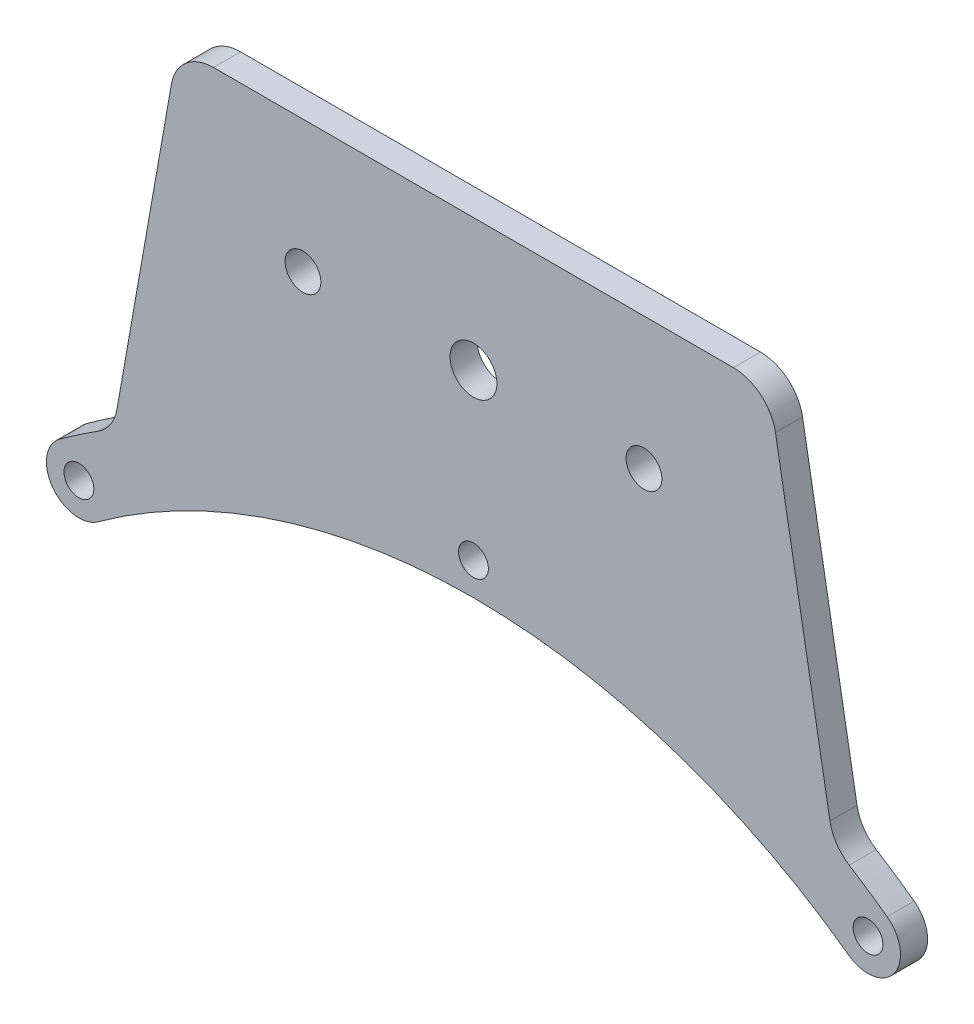
ISO-10303-21;
HEADER;
FILE_DESCRIPTION(('STEP AP214'),'2;1');
FILE_NAME('part.step','',(''),(''),'','','');
FILE_SCHEMA(('AUTOMOTIVE_DESIGN { 1 0 10303 214 1 1 1 1 }'));
ENDSEC;
DATA;
#1=APPLICATION_CONTEXT('core data for automotive mechanical design processes');
#2=APPLICATION_PROTOCOL_DEFINITION('international standard','automotive_design',2000,#1);
#3=PRODUCT_CONTEXT('',#1,'mechanical');
#4=PRODUCT('Part','Part','',(#3));
#5=PRODUCT_RELATED_PRODUCT_CATEGORY('part','',(#4));
#6=PRODUCT_DEFINITION_FORMATION('','',#4);
#7=PRODUCT_DEFINITION_CONTEXT('part definition',#1,'design');
#8=PRODUCT_DEFINITION('design','',#6,#7);
#9=PRODUCT_DEFINITION_SHAPE('','',#8);
#10=(LENGTH_UNIT() NAMED_UNIT(*) SI_UNIT(.MILLI.,.METRE.));
#11=(NAMED_UNIT(*) PLANE_ANGLE_UNIT() SI_UNIT($,.RADIAN.));
#12=(NAMED_UNIT(*) SI_UNIT($,.STERADIAN.) SOLID_ANGLE_UNIT());
#13=UNCERTAINTY_MEASURE_WITH_UNIT(LENGTH_MEASURE(1.E-05),#10,'distance_accuracy_value','');
#14=(GEOMETRIC_REPRESENTATION_CONTEXT(3) GLOBAL_UNCERTAINTY_ASSIGNED_CONTEXT((#13)) GLOBAL_UNIT_ASSIGNED_CONTEXT((#10,
#11,#12)) REPRESENTATION_CONTEXT('',''));
#15=CARTESIAN_POINT('',(0.,0.,0.));
#16=DIRECTION('',(0.,0.,1.));
#17=DIRECTION('',(1.,0.,0.));
#18=AXIS2_PLACEMENT_3D('',#15,#16,#17);
#19=CARTESIAN_POINT('',(46.2822107655095,-15.0380018629167,1.5875));
#20=DIRECTION('',(0.,0.,-1.));
#21=DIRECTION('',(-1.,0.,0.));
#22=AXIS2_PLACEMENT_3D('',#19,#20,#21);
#23=PLANE('',#22);
#24=CARTESIAN_POINT('',(46.2822107655095,-15.0380018629167,1.5875));
#25=DIRECTION('',(0.,0.,1.));
#26=DIRECTION('',(-1.,0.,0.));
#27=AXIS2_PLACEMENT_3D('',#24,#25,#26);
#28=CIRCLE('',#27,3.80999999999999);
#29=CARTESIAN_POINT('',(44.0427489542751,-18.1203566114853,1.5875));
#30=VERTEX_POINT('',#29);
#31=CARTESIAN_POINT('',(48.5216725767438,-11.9556471143482,1.5875));
#32=VERTEX_POINT('',#31);
#33=EDGE_CURVE('E255',#30,#32,#28,.T.);
#34=ORIENTED_EDGE('',*,*,#33,.T.);
#35=CARTESIAN_POINT('',(0.,-78.74,1.5875));
#36=DIRECTION('',(0.,0.,1.));
#37=DIRECTION('',(1.,0.,0.));
#38=AXIS2_PLACEMENT_3D('',#35,#36,#37);
#39=CIRCLE('',#38,82.55);
#40=CARTESIAN_POINT('',(44.0718905745348,-8.93906188892425,1.5875));
#41=VERTEX_POINT('',#40);
#42=EDGE_CURVE('E135',#32,#41,#39,.T.);
#43=ORIENTED_EDGE('',*,*,#42,.T.);
#44=CARTESIAN_POINT('',(46.7412964239918,-4.71126430497053,1.5875));
#45=DIRECTION('',(0.,0.,-1.));
#46=DIRECTION('',(-1.,0.,0.));
#47=AXIS2_PLACEMENT_3D('',#44,#45,#46);
#48=CIRCLE('',#47,5.);
#49=CARTESIAN_POINT('',(41.8172576589308,-5.57950519330519,1.5875));
#50=VERTEX_POINT('',#49);
#51=EDGE_CURVE('E254',#41,#50,#48,.T.);
#52=ORIENTED_EDGE('',*,*,#51,.T.);
#53=DIRECTION('',(-0.173648177666931,0.984807753012208,0.));
#54=VECTOR('',#53,1.);
#55=CARTESIAN_POINT('',(35.424038765061,30.6782408883346,1.5875));
#56=LINE('',#55,#54);
#57=CARTESIAN_POINT('',(35.424038765061,30.6782408883346,1.5875));
#58=VERTEX_POINT('',#57);
#59=EDGE_CURVE('E261',#50,#58,#56,.T.);
#60=ORIENTED_EDGE('',*,*,#59,.T.);
#61=CARTESIAN_POINT('',(30.5,29.81,1.5875));
#62=DIRECTION('',(0.,0.,1.));
#63=DIRECTION('',(-1.,0.,0.));
#64=AXIS2_PLACEMENT_3D('',#61,#62,#63);
#65=CIRCLE('',#64,5.);
#66=CARTESIAN_POINT('',(30.5,34.81,1.5875));
#67=VERTEX_POINT('',#66);
#68=EDGE_CURVE('E296',#58,#67,#65,.T.);
#69=ORIENTED_EDGE('',*,*,#68,.T.);
#70=DIRECTION('',(-1.,0.,0.));
#71=VECTOR('',#70,1.);
#72=CARTESIAN_POINT('',(-30.5,34.81,1.5875));
#73=LINE('',#72,#71);
#74=CARTESIAN_POINT('',(-30.5,34.81,1.5875));
#75=VERTEX_POINT('',#74);
#76=EDGE_CURVE('E300',#67,#75,#73,.T.);
#77=ORIENTED_EDGE('',*,*,#76,.T.);
#78=CARTESIAN_POINT('',(-30.5,29.81,1.5875));
#79=DIRECTION('',(0.,0.,1.));
#80=DIRECTION('',(1.,0.,0.));
#81=AXIS2_PLACEMENT_3D('',#78,#79,#80);
#82=CIRCLE('',#81,5.);
#83=CARTESIAN_POINT('',(-35.424038765061,30.6782408883346,1.5875));
#84=VERTEX_POINT('',#83);
#85=EDGE_CURVE('E303',#75,#84,#82,.T.);
#86=ORIENTED_EDGE('',*,*,#85,.T.);
#87=DIRECTION('',(-0.17364817766693,-0.984807753012208,0.));
#88=VECTOR('',#87,1.);
#89=CARTESIAN_POINT('',(-35.424038765061,30.6782408883346,1.5875));
#90=LINE('',#89,#88);
#91=CARTESIAN_POINT('',(-41.8172576589307,-5.57950519330519,1.5875));
#92=VERTEX_POINT('',#91);
#93=EDGE_CURVE('E523',#84,#92,#90,.T.);
#94=ORIENTED_EDGE('',*,*,#93,.T.);
#95=CARTESIAN_POINT('',(-46.7412964239918,-4.71126430497054,1.5875));
#96=DIRECTION('',(0.,0.,-1.));
#97=DIRECTION('',(-1.,0.,0.));
#98=AXIS2_PLACEMENT_3D('',#95,#96,#97);
#99=CIRCLE('',#98,5.);
#100=CARTESIAN_POINT('',(-44.0718905745348,-8.93906188892424,1.5875));
#101=VERTEX_POINT('',#100);
#102=EDGE_CURVE('E174',#92,#101,#99,.T.);
#103=ORIENTED_EDGE('',*,*,#102,.T.);
#104=CARTESIAN_POINT('',(0.,-78.74,1.5875));
#105=DIRECTION('',(0.,0.,1.));
#106=DIRECTION('',(1.,0.,0.));
#107=AXIS2_PLACEMENT_3D('',#104,#105,#106);
#108=CIRCLE('',#107,82.55);
#109=CARTESIAN_POINT('',(-48.5216725767438,-11.9556471143482,1.5875));
#110=VERTEX_POINT('',#109);
#111=EDGE_CURVE('E168',#101,#110,#108,.T.);
#112=ORIENTED_EDGE('',*,*,#111,.T.);
#113=CARTESIAN_POINT('',(-46.2822107655095,-15.0380018629167,1.5875));
#114=DIRECTION('',(0.,0.,1.));
#115=DIRECTION('',(1.,0.,0.));
#116=AXIS2_PLACEMENT_3D('',#113,#114,#115);
#117=CIRCLE('',#116,3.80999999999999);
#118=CARTESIAN_POINT('',(-44.0427489542751,-18.1203566114853,1.5875));
#119=VERTEX_POINT('',#118);
#120=EDGE_CURVE('E172',#110,#119,#117,.T.);
#121=ORIENTED_EDGE('',*,*,#120,.T.);
#122=CARTESIAN_POINT('',(0.,-78.74,1.5875));
#123=DIRECTION('',(0.,0.,-1.));
#124=DIRECTION('',(-1.,0.,0.));
#125=AXIS2_PLACEMENT_3D('',#122,#123,#124);
#126=CIRCLE('',#125,74.93);
#127=EDGE_CURVE('E67',#119,#30,#126,.T.);
#128=ORIENTED_EDGE('',*,*,#127,.T.);
#129=EDGE_LOOP('',(#34,#43,#52,#60,#69,#77,#86,#94,#103,#112,#121,#128));
#130=FACE_BOUND('',#129,.T.);
#131=CARTESIAN_POINT('',(0.,0.,1.5875));
#132=DIRECTION('',(0.,0.,1.));
#133=DIRECTION('',(1.,0.,0.));
#134=AXIS2_PLACEMENT_3D('',#131,#132,#133);
#135=CIRCLE('',#134,1.75);
#136=CARTESIAN_POINT('',(1.75,0.,1.5875));
#137=VERTEX_POINT('',#136);
#138=EDGE_CURVE('E241',#137,#137,#135,.T.);
#139=ORIENTED_EDGE('',*,*,#138,.F.);
#140=EDGE_LOOP('',(#139));
#141=FACE_BOUND('',#140,.T.);
#142=CARTESIAN_POINT('',(-46.2822107655095,-15.0380018629167,1.5875));
#143=DIRECTION('',(0.,0.,1.));
#144=DIRECTION('',(1.,0.,0.));
#145=AXIS2_PLACEMENT_3D('',#142,#143,#144);
#146=CIRCLE('',#145,1.75);
#147=CARTESIAN_POINT('',(-44.5322107655095,-15.0380018629167,1.5875));
#148=VERTEX_POINT('',#147);
#149=EDGE_CURVE('E393',#148,#148,#146,.T.);
#150=ORIENTED_EDGE('',*,*,#149,.F.);
#151=EDGE_LOOP('',(#150));
#152=FACE_BOUND('',#151,.T.);
#153=CARTESIAN_POINT('',(46.2822107655095,-15.0380018629167,1.5875));
#154=DIRECTION('',(0.,0.,1.));
#155=DIRECTION('',(1.,0.,0.));
#156=AXIS2_PLACEMENT_3D('',#153,#154,#155);
#157=CIRCLE('',#156,1.75000000000001);
#158=CARTESIAN_POINT('',(48.0322107655095,-15.0380018629167,1.5875));
#159=VERTEX_POINT('',#158);
#160=EDGE_CURVE('E403',#159,#159,#157,.T.);
#161=ORIENTED_EDGE('',*,*,#160,.F.);
#162=EDGE_LOOP('',(#161));
#163=FACE_BOUND('',#162,.T.);
#164=CARTESIAN_POINT('',(-20.,19.31,1.5875));
#165=DIRECTION('',(0.,0.,1.));
#166=DIRECTION('',(1.,0.,0.));
#167=AXIS2_PLACEMENT_3D('',#164,#165,#166);
#168=CIRCLE('',#167,2.1);
#169=CARTESIAN_POINT('',(-17.9,19.31,1.5875));
#170=VERTEX_POINT('',#169);
#171=EDGE_CURVE('E218',#170,#170,#168,.T.);
#172=ORIENTED_EDGE('',*,*,#171,.F.);
#173=EDGE_LOOP('',(#172));
#174=FACE_BOUND('',#173,.T.);
#175=CARTESIAN_POINT('',(20.,19.31,1.5875));
#176=DIRECTION('',(0.,0.,1.));
#177=DIRECTION('',(1.,0.,0.));
#178=AXIS2_PLACEMENT_3D('',#175,#176,#177);
#179=CIRCLE('',#178,2.1);
#180=CARTESIAN_POINT('',(22.1,19.31,1.5875));
#181=VERTEX_POINT('',#180);
#182=EDGE_CURVE('E214',#181,#181,#179,.T.);
#183=ORIENTED_EDGE('',*,*,#182,.F.);
#184=EDGE_LOOP('',(#183));
#185=FACE_BOUND('',#184,.T.);
#186=CARTESIAN_POINT('',(0.,19.31,1.5875));
#187=DIRECTION('',(0.,0.,1.));
#188=DIRECTION('',(1.,0.,0.));
#189=AXIS2_PLACEMENT_3D('',#186,#187,#188);
#190=CIRCLE('',#189,2.75);
#191=CARTESIAN_POINT('',(2.75,19.31,1.5875));
#192=VERTEX_POINT('',#191);
#193=EDGE_CURVE('E215',#192,#192,#190,.T.);
#194=ORIENTED_EDGE('',*,*,#193,.F.);
#195=EDGE_LOOP('',(#194));
#196=FACE_BOUND('',#195,.T.);
#197=ADVANCED_FACE('F44',(#130,#141,#152,#163,#174,#185,#196),#23,.F.);
#198=CARTESIAN_POINT('',(46.2822107655095,-15.0380018629167,-1.5875));
#199=DIRECTION('',(0.,0.,-1.));
#200=DIRECTION('',(-1.,0.,0.));
#201=AXIS2_PLACEMENT_3D('',#198,#199,#200);
#202=PLANE('',#201);
#203=CARTESIAN_POINT('',(20.,19.31,-1.5875));
#204=DIRECTION('',(0.,0.,1.));
#205=DIRECTION('',(1.,0.,0.));
#206=AXIS2_PLACEMENT_3D('',#203,#204,#205);
#207=CIRCLE('',#206,2.1);
#208=CARTESIAN_POINT('',(22.1,19.31,-1.5875));
#209=VERTEX_POINT('',#208);
#210=EDGE_CURVE('E208',#209,#209,#207,.T.);
#211=ORIENTED_EDGE('',*,*,#210,.T.);
#212=EDGE_LOOP('',(#211));
#213=FACE_BOUND('',#212,.T.);
#214=CARTESIAN_POINT('',(46.2822107655095,-15.0380018629167,-1.5875));
#215=DIRECTION('',(0.,0.,1.));
#216=DIRECTION('',(1.,0.,0.));
#217=AXIS2_PLACEMENT_3D('',#214,#215,#216);
#218=CIRCLE('',#217,1.75000000000001);
#219=CARTESIAN_POINT('',(48.0322107655095,-15.0380018629167,-1.5875));
#220=VERTEX_POINT('',#219);
#221=EDGE_CURVE('E223',#220,#220,#218,.T.);
#222=ORIENTED_EDGE('',*,*,#221,.T.);
#223=EDGE_LOOP('',(#222));
#224=FACE_BOUND('',#223,.T.);
#225=CARTESIAN_POINT('',(0.,0.,-1.5875));
#226=DIRECTION('',(0.,0.,1.));
#227=DIRECTION('',(1.,0.,0.));
#228=AXIS2_PLACEMENT_3D('',#225,#226,#227);
#229=CIRCLE('',#228,1.75);
#230=CARTESIAN_POINT('',(1.75,0.,-1.5875));
#231=VERTEX_POINT('',#230);
#232=EDGE_CURVE('E388',#231,#231,#229,.T.);
#233=ORIENTED_EDGE('',*,*,#232,.T.);
#234=EDGE_LOOP('',(#233));
#235=FACE_BOUND('',#234,.T.);
#236=CARTESIAN_POINT('',(46.2822107655095,-15.0380018629167,-1.5875));
#237=DIRECTION('',(0.,0.,1.));
#238=DIRECTION('',(-1.,0.,0.));
#239=AXIS2_PLACEMENT_3D('',#236,#237,#238);
#240=CIRCLE('',#239,3.80999999999999);
#241=CARTESIAN_POINT('',(44.0427489542751,-18.1203566114853,-1.5875));
#242=VERTEX_POINT('',#241);
#243=CARTESIAN_POINT('',(48.5216725767438,-11.9556471143482,-1.5875));
#244=VERTEX_POINT('',#243);
#245=EDGE_CURVE('E235',#242,#244,#240,.T.);
#246=ORIENTED_EDGE('',*,*,#245,.F.);
#247=CARTESIAN_POINT('',(0.,-78.74,-1.5875));
#248=DIRECTION('',(0.,0.,-1.));
#249=DIRECTION('',(-1.,0.,0.));
#250=AXIS2_PLACEMENT_3D('',#247,#248,#249);
#251=CIRCLE('',#250,74.93);
#252=CARTESIAN_POINT('',(-44.0427489542751,-18.1203566114853,-1.5875));
#253=VERTEX_POINT('',#252);
#254=EDGE_CURVE('E127',#253,#242,#251,.T.);
#255=ORIENTED_EDGE('',*,*,#254,.F.);
#256=CARTESIAN_POINT('',(-46.2822107655095,-15.0380018629167,-1.5875));
#257=DIRECTION('',(0.,0.,1.));
#258=DIRECTION('',(1.,0.,0.));
#259=AXIS2_PLACEMENT_3D('',#256,#257,#258);
#260=CIRCLE('',#259,3.80999999999999);
#261=CARTESIAN_POINT('',(-48.5216725767438,-11.9556471143482,-1.5875));
#262=VERTEX_POINT('',#261);
#263=EDGE_CURVE('E119',#262,#253,#260,.T.);
#264=ORIENTED_EDGE('',*,*,#263,.F.);
#265=CARTESIAN_POINT('',(0.,-78.74,-1.5875));
#266=DIRECTION('',(0.,0.,1.));
#267=DIRECTION('',(1.,0.,0.));
#268=AXIS2_PLACEMENT_3D('',#265,#266,#267);
#269=CIRCLE('',#268,82.55);
#270=CARTESIAN_POINT('',(-44.0718905745348,-8.93906188892424,-1.5875));
#271=VERTEX_POINT('',#270);
#272=EDGE_CURVE('E183',#271,#262,#269,.T.);
#273=ORIENTED_EDGE('',*,*,#272,.F.);
#274=CARTESIAN_POINT('',(-46.7412964239918,-4.71126430497054,-1.5875));
#275=DIRECTION('',(0.,0.,-1.));
#276=DIRECTION('',(-1.,0.,0.));
#277=AXIS2_PLACEMENT_3D('',#274,#275,#276);
#278=CIRCLE('',#277,5.);
#279=CARTESIAN_POINT('',(-41.8172576589307,-5.57950519330519,-1.5875));
#280=VERTEX_POINT('',#279);
#281=EDGE_CURVE('E313',#280,#271,#278,.T.);
#282=ORIENTED_EDGE('',*,*,#281,.F.);
#283=DIRECTION('',(-0.17364817766693,-0.984807753012208,0.));
#284=VECTOR('',#283,1.);
#285=CARTESIAN_POINT('',(-35.424038765061,30.6782408883346,-1.5875));
#286=LINE('',#285,#284);
#287=CARTESIAN_POINT('',(-35.424038765061,30.6782408883346,-1.5875));
#288=VERTEX_POINT('',#287);
#289=EDGE_CURVE('E318',#288,#280,#286,.T.);
#290=ORIENTED_EDGE('',*,*,#289,.F.);
#291=CARTESIAN_POINT('',(-30.5,29.81,-1.5875));
#292=DIRECTION('',(0.,0.,1.));
#293=DIRECTION('',(1.,0.,0.));
#294=AXIS2_PLACEMENT_3D('',#291,#292,#293);
#295=CIRCLE('',#294,5.);
#296=CARTESIAN_POINT('',(-30.5,34.81,-1.5875));
#297=VERTEX_POINT('',#296);
#298=EDGE_CURVE('E343',#297,#288,#295,.T.);
#299=ORIENTED_EDGE('',*,*,#298,.F.);
#300=DIRECTION('',(-1.,0.,0.));
#301=VECTOR('',#300,1.);
#302=CARTESIAN_POINT('',(-30.5,34.81,-1.5875));
#303=LINE('',#302,#301);
#304=CARTESIAN_POINT('',(30.5,34.81,-1.5875));
#305=VERTEX_POINT('',#304);
#306=EDGE_CURVE('E340',#305,#297,#303,.T.);
#307=ORIENTED_EDGE('',*,*,#306,.F.);
#308=CARTESIAN_POINT('',(30.5,29.81,-1.5875));
#309=DIRECTION('',(0.,0.,1.));
#310=DIRECTION('',(-1.,0.,0.));
#311=AXIS2_PLACEMENT_3D('',#308,#309,#310);
#312=CIRCLE('',#311,5.);
#313=CARTESIAN_POINT('',(35.424038765061,30.6782408883346,-1.5875));
#314=VERTEX_POINT('',#313);
#315=EDGE_CURVE('E344',#314,#305,#312,.T.);
#316=ORIENTED_EDGE('',*,*,#315,.F.);
#317=DIRECTION('',(-0.173648177666931,0.984807753012208,0.));
#318=VECTOR('',#317,1.);
#319=CARTESIAN_POINT('',(35.424038765061,30.6782408883346,-1.5875));
#320=LINE('',#319,#318);
#321=CARTESIAN_POINT('',(41.8172576589308,-5.57950519330519,-1.5875));
#322=VERTEX_POINT('',#321);
#323=EDGE_CURVE('E507',#322,#314,#320,.T.);
#324=ORIENTED_EDGE('',*,*,#323,.F.);
#325=CARTESIAN_POINT('',(46.7412964239918,-4.71126430497053,-1.5875));
#326=DIRECTION('',(0.,0.,-1.));
#327=DIRECTION('',(-1.,0.,0.));
#328=AXIS2_PLACEMENT_3D('',#325,#326,#327);
#329=CIRCLE('',#328,5.);
#330=CARTESIAN_POINT('',(44.0718905745348,-8.93906188892425,-1.5875));
#331=VERTEX_POINT('',#330);
#332=EDGE_CURVE('E245',#331,#322,#329,.T.);
#333=ORIENTED_EDGE('',*,*,#332,.F.);
#334=CARTESIAN_POINT('',(0.,-78.74,-1.5875));
#335=DIRECTION('',(0.,0.,1.));
#336=DIRECTION('',(1.,0.,0.));
#337=AXIS2_PLACEMENT_3D('',#334,#335,#336);
#338=CIRCLE('',#337,82.55);
#339=EDGE_CURVE('E240',#244,#331,#338,.T.);
#340=ORIENTED_EDGE('',*,*,#339,.F.);
#341=EDGE_LOOP('',(#246,#255,#264,#273,#282,#290,#299,#307,#316,#324,#333,#340));
#342=FACE_BOUND('',#341,.T.);
#343=CARTESIAN_POINT('',(-46.2822107655095,-15.0380018629167,-1.5875));
#344=DIRECTION('',(0.,0.,1.));
#345=DIRECTION('',(1.,0.,0.));
#346=AXIS2_PLACEMENT_3D('',#343,#344,#345);
#347=CIRCLE('',#346,1.75);
#348=CARTESIAN_POINT('',(-44.5322107655095,-15.0380018629167,-1.5875));
#349=VERTEX_POINT('',#348);
#350=EDGE_CURVE('E389',#349,#349,#347,.T.);
#351=ORIENTED_EDGE('',*,*,#350,.T.);
#352=EDGE_LOOP('',(#351));
#353=FACE_BOUND('',#352,.T.);
#354=CARTESIAN_POINT('',(-20.,19.31,-1.5875));
#355=DIRECTION('',(0.,0.,1.));
#356=DIRECTION('',(1.,0.,0.));
#357=AXIS2_PLACEMENT_3D('',#354,#355,#356);
#358=CIRCLE('',#357,2.1);
#359=CARTESIAN_POINT('',(-17.9,19.31,-1.5875));
#360=VERTEX_POINT('',#359);
#361=EDGE_CURVE('E224',#360,#360,#358,.T.);
#362=ORIENTED_EDGE('',*,*,#361,.T.);
#363=EDGE_LOOP('',(#362));
#364=FACE_BOUND('',#363,.T.);
#365=CARTESIAN_POINT('',(0.,19.31,-1.5875));
#366=DIRECTION('',(0.,0.,1.));
#367=DIRECTION('',(1.,0.,0.));
#368=AXIS2_PLACEMENT_3D('',#365,#366,#367);
#369=CIRCLE('',#368,2.75);
#370=CARTESIAN_POINT('',(2.75,19.31,-1.5875));
#371=VERTEX_POINT('',#370);
#372=EDGE_CURVE('E418',#371,#371,#369,.T.);
#373=ORIENTED_EDGE('',*,*,#372,.T.);
#374=EDGE_LOOP('',(#373));
#375=FACE_BOUND('',#374,.T.);
#376=ADVANCED_FACE('F369',(#213,#224,#235,#342,#353,#364,#375),#202,.T.);
#377=CARTESIAN_POINT('',(46.2822107655095,-15.0380018629167,1.5875));
#378=DIRECTION('',(0.,0.,-1.));
#379=DIRECTION('',(-1.,0.,0.));
#380=AXIS2_PLACEMENT_3D('',#377,#378,#379);
#381=CYLINDRICAL_SURFACE('',#380,3.80999999999999);
#382=ORIENTED_EDGE('',*,*,#245,.T.);
#383=DIRECTION('',(0.,0.,-1.));
#384=VECTOR('',#383,1.);
#385=CARTESIAN_POINT('',(48.5216725767438,-11.9556471143482,1.5875));
#386=LINE('',#385,#384);
#387=EDGE_CURVE('E12',#32,#244,#386,.T.);
#388=ORIENTED_EDGE('',*,*,#387,.F.);
#389=ORIENTED_EDGE('',*,*,#33,.F.);
#390=DIRECTION('',(0.,0.,-1.));
#391=VECTOR('',#390,1.);
#392=CARTESIAN_POINT('',(44.0427489542751,-18.1203566114853,1.5875));
#393=LINE('',#392,#391);
#394=EDGE_CURVE('E192',#30,#242,#393,.T.);
#395=ORIENTED_EDGE('',*,*,#394,.T.);
#396=EDGE_LOOP('',(#382,#388,#389,#395));
#397=FACE_BOUND('',#396,.T.);
#398=ADVANCED_FACE('F47',(#397),#381,.T.);
#399=CARTESIAN_POINT('',(0.,-78.74,1.5875));
#400=DIRECTION('',(0.,0.,-1.));
#401=DIRECTION('',(-1.,0.,0.));
#402=AXIS2_PLACEMENT_3D('',#399,#400,#401);
#403=CYLINDRICAL_SURFACE('',#402,82.55);
#404=ORIENTED_EDGE('',*,*,#339,.T.);
#405=DIRECTION('',(0.,0.,-1.));
#406=VECTOR('',#405,1.);
#407=CARTESIAN_POINT('',(44.0718905745348,-8.93906188892425,1.5875));
#408=LINE('',#407,#406);
#409=EDGE_CURVE('E56',#41,#331,#408,.T.);
#410=ORIENTED_EDGE('',*,*,#409,.F.);
#411=ORIENTED_EDGE('',*,*,#42,.F.);
#412=ORIENTED_EDGE('',*,*,#387,.T.);
#413=EDGE_LOOP('',(#404,#410,#411,#412));
#414=FACE_BOUND('',#413,.T.);
#415=ADVANCED_FACE('F494',(#414),#403,.T.);
#416=CARTESIAN_POINT('',(46.7412964239918,-4.71126430497053,1.5875));
#417=DIRECTION('',(0.,0.,-1.));
#418=DIRECTION('',(-1.,0.,0.));
#419=AXIS2_PLACEMENT_3D('',#416,#417,#418);
#420=CYLINDRICAL_SURFACE('',#419,5.);
#421=ORIENTED_EDGE('',*,*,#332,.T.);
#422=DIRECTION('',(0.,0.,-1.));
#423=VECTOR('',#422,1.);
#424=CARTESIAN_POINT('',(41.8172576589308,-5.57950519330519,1.5875));
#425=LINE('',#424,#423);
#426=EDGE_CURVE('E275',#50,#322,#425,.T.);
#427=ORIENTED_EDGE('',*,*,#426,.F.);
#428=ORIENTED_EDGE('',*,*,#51,.F.);
#429=ORIENTED_EDGE('',*,*,#409,.T.);
#430=EDGE_LOOP('',(#421,#427,#428,#429));
#431=FACE_BOUND('',#430,.T.);
#432=ADVANCED_FACE('F490',(#431),#420,.F.);
#433=CARTESIAN_POINT('',(35.424038765061,30.6782408883346,1.5875));
#434=DIRECTION('',(-0.984807753012208,-0.173648177666931,0.));
#435=DIRECTION('',(0.173648177666931,-0.984807753012208,0.));
#436=AXIS2_PLACEMENT_3D('',#433,#434,#435);
#437=PLANE('',#436);
#438=ORIENTED_EDGE('',*,*,#323,.T.);
#439=DIRECTION('',(0.,0.,-1.));
#440=VECTOR('',#439,1.);
#441=CARTESIAN_POINT('',(35.424038765061,30.6782408883346,1.5875));
#442=LINE('',#441,#440);
#443=EDGE_CURVE('E279',#58,#314,#442,.T.);
#444=ORIENTED_EDGE('',*,*,#443,.F.);
#445=ORIENTED_EDGE('',*,*,#59,.F.);
#446=ORIENTED_EDGE('',*,*,#426,.T.);
#447=EDGE_LOOP('',(#438,#444,#445,#446));
#448=FACE_BOUND('',#447,.T.);
#449=ADVANCED_FACE('F486',(#448),#437,.F.);
#450=CARTESIAN_POINT('',(30.5,29.81,1.5875));
#451=DIRECTION('',(0.,0.,-1.));
#452=DIRECTION('',(-1.,0.,0.));
#453=AXIS2_PLACEMENT_3D('',#450,#451,#452);
#454=CYLINDRICAL_SURFACE('',#453,5.);
#455=ORIENTED_EDGE('',*,*,#315,.T.);
#456=DIRECTION('',(0.,0.,-1.));
#457=VECTOR('',#456,1.);
#458=CARTESIAN_POINT('',(30.5,34.81,1.5875));
#459=LINE('',#458,#457);
#460=EDGE_CURVE('E284',#67,#305,#459,.T.);
#461=ORIENTED_EDGE('',*,*,#460,.F.);
#462=ORIENTED_EDGE('',*,*,#68,.F.);
#463=ORIENTED_EDGE('',*,*,#443,.T.);
#464=EDGE_LOOP('',(#455,#461,#462,#463));
#465=FACE_BOUND('',#464,.T.);
#466=ADVANCED_FACE('F481',(#465),#454,.T.);
#467=CARTESIAN_POINT('',(-30.5,34.81,1.5875));
#468=DIRECTION('',(0.,-1.,0.));
#469=DIRECTION('',(1.,0.,0.));
#470=AXIS2_PLACEMENT_3D('',#467,#468,#469);
#471=PLANE('',#470);
#472=ORIENTED_EDGE('',*,*,#306,.T.);
#473=DIRECTION('',(0.,0.,-1.));
#474=VECTOR('',#473,1.);
#475=CARTESIAN_POINT('',(-30.5,34.81,1.5875));
#476=LINE('',#475,#474);
#477=EDGE_CURVE('E289',#75,#297,#476,.T.);
#478=ORIENTED_EDGE('',*,*,#477,.F.);
#479=ORIENTED_EDGE('',*,*,#76,.F.);
#480=ORIENTED_EDGE('',*,*,#460,.T.);
#481=EDGE_LOOP('',(#472,#478,#479,#480));
#482=FACE_BOUND('',#481,.T.);
#483=ADVANCED_FACE('F478',(#482),#471,.F.);
#484=CARTESIAN_POINT('',(-30.5,29.81,1.5875));
#485=DIRECTION('',(0.,0.,-1.));
#486=DIRECTION('',(-1.,0.,0.));
#487=AXIS2_PLACEMENT_3D('',#484,#485,#486);
#488=CYLINDRICAL_SURFACE('',#487,5.);
#489=ORIENTED_EDGE('',*,*,#298,.T.);
#490=DIRECTION('',(0.,0.,-1.));
#491=VECTOR('',#490,1.);
#492=CARTESIAN_POINT('',(-35.424038765061,30.6782408883346,1.5875));
#493=LINE('',#492,#491);
#494=EDGE_CURVE('E363',#84,#288,#493,.T.);
#495=ORIENTED_EDGE('',*,*,#494,.F.);
#496=ORIENTED_EDGE('',*,*,#85,.F.);
#497=ORIENTED_EDGE('',*,*,#477,.T.);
#498=EDGE_LOOP('',(#489,#495,#496,#497));
#499=FACE_BOUND('',#498,.T.);
#500=ADVANCED_FACE('F474',(#499),#488,.T.);
#501=CARTESIAN_POINT('',(-35.424038765061,30.6782408883346,1.5875));
#502=DIRECTION('',(0.984807753012208,-0.17364817766693,0.));
#503=DIRECTION('',(0.17364817766693,0.984807753012208,0.));
#504=AXIS2_PLACEMENT_3D('',#501,#502,#503);
#505=PLANE('',#504);
#506=ORIENTED_EDGE('',*,*,#289,.T.);
#507=DIRECTION('',(0.,0.,-1.));
#508=VECTOR('',#507,1.);
#509=CARTESIAN_POINT('',(-41.8172576589307,-5.57950519330519,1.5875));
#510=LINE('',#509,#508);
#511=EDGE_CURVE('E337',#92,#280,#510,.T.);
#512=ORIENTED_EDGE('',*,*,#511,.F.);
#513=ORIENTED_EDGE('',*,*,#93,.F.);
#514=ORIENTED_EDGE('',*,*,#494,.T.);
#515=EDGE_LOOP('',(#506,#512,#513,#514));
#516=FACE_BOUND('',#515,.T.);
#517=ADVANCED_FACE('F361',(#516),#505,.F.);
#518=CARTESIAN_POINT('',(-46.7412964239918,-4.71126430497054,1.5875));
#519=DIRECTION('',(0.,0.,-1.));
#520=DIRECTION('',(-1.,0.,0.));
#521=AXIS2_PLACEMENT_3D('',#518,#519,#520);
#522=CYLINDRICAL_SURFACE('',#521,5.);
#523=ORIENTED_EDGE('',*,*,#281,.T.);
#524=DIRECTION('',(0.,0.,-1.));
#525=VECTOR('',#524,1.);
#526=CARTESIAN_POINT('',(-44.0718905745348,-8.93906188892424,1.5875));
#527=LINE('',#526,#525);
#528=EDGE_CURVE('E185',#101,#271,#527,.T.);
#529=ORIENTED_EDGE('',*,*,#528,.F.);
#530=ORIENTED_EDGE('',*,*,#102,.F.);
#531=ORIENTED_EDGE('',*,*,#511,.T.);
#532=EDGE_LOOP('',(#523,#529,#530,#531));
#533=FACE_BOUND('',#532,.T.);
#534=ADVANCED_FACE('F367',(#533),#522,.F.);
#535=CARTESIAN_POINT('',(0.,-78.74,1.5875));
#536=DIRECTION('',(0.,0.,-1.));
#537=DIRECTION('',(-1.,0.,0.));
#538=AXIS2_PLACEMENT_3D('',#535,#536,#537);
#539=CYLINDRICAL_SURFACE('',#538,82.55);
#540=ORIENTED_EDGE('',*,*,#272,.T.);
#541=DIRECTION('',(0.,0.,-1.));
#542=VECTOR('',#541,1.);
#543=CARTESIAN_POINT('',(-48.5216725767438,-11.9556471143482,1.5875));
#544=LINE('',#543,#542);
#545=EDGE_CURVE('E180',#110,#262,#544,.T.);
#546=ORIENTED_EDGE('',*,*,#545,.F.);
#547=ORIENTED_EDGE('',*,*,#111,.F.);
#548=ORIENTED_EDGE('',*,*,#528,.T.);
#549=EDGE_LOOP('',(#540,#546,#547,#548));
#550=FACE_BOUND('',#549,.T.);
#551=ADVANCED_FACE('F181',(#550),#539,.T.);
#552=CARTESIAN_POINT('',(-46.2822107655095,-15.0380018629167,1.5875));
#553=DIRECTION('',(0.,0.,-1.));
#554=DIRECTION('',(-1.,0.,0.));
#555=AXIS2_PLACEMENT_3D('',#552,#553,#554);
#556=CYLINDRICAL_SURFACE('',#555,3.80999999999999);
#557=ORIENTED_EDGE('',*,*,#263,.T.);
#558=DIRECTION('',(0.,0.,-1.));
#559=VECTOR('',#558,1.);
#560=CARTESIAN_POINT('',(-44.0427489542751,-18.1203566114853,1.5875));
#561=LINE('',#560,#559);
#562=EDGE_CURVE('E186',#119,#253,#561,.T.);
#563=ORIENTED_EDGE('',*,*,#562,.F.);
#564=ORIENTED_EDGE('',*,*,#120,.F.);
#565=ORIENTED_EDGE('',*,*,#545,.T.);
#566=EDGE_LOOP('',(#557,#563,#564,#565));
#567=FACE_BOUND('',#566,.T.);
#568=ADVANCED_FACE('F188',(#567),#556,.T.);
#569=CARTESIAN_POINT('',(0.,-78.74,1.5875));
#570=DIRECTION('',(0.,0.,-1.));
#571=DIRECTION('',(-1.,0.,0.));
#572=AXIS2_PLACEMENT_3D('',#569,#570,#571);
#573=CYLINDRICAL_SURFACE('',#572,74.93);
#574=ORIENTED_EDGE('',*,*,#254,.T.);
#575=ORIENTED_EDGE('',*,*,#394,.F.);
#576=ORIENTED_EDGE('',*,*,#127,.F.);
#577=ORIENTED_EDGE('',*,*,#562,.T.);
#578=EDGE_LOOP('',(#574,#575,#576,#577));
#579=FACE_BOUND('',#578,.T.);
#580=ADVANCED_FACE('F455',(#579),#573,.F.);
#581=CARTESIAN_POINT('',(0.,0.,1.5875));
#582=DIRECTION('',(0.,0.,-1.));
#583=DIRECTION('',(-1.,0.,0.));
#584=AXIS2_PLACEMENT_3D('',#581,#582,#583);
#585=CYLINDRICAL_SURFACE('',#584,1.75);
#586=ORIENTED_EDGE('',*,*,#138,.T.);
#587=EDGE_LOOP('',(#586));
#588=FACE_BOUND('',#587,.T.);
#589=ORIENTED_EDGE('',*,*,#232,.F.);
#590=EDGE_LOOP('',(#589));
#591=FACE_BOUND('',#590,.T.);
#592=ADVANCED_FACE('F449',(#588,#591),#585,.F.);
#593=CARTESIAN_POINT('',(-46.2822107655095,-15.0380018629167,1.5875));
#594=DIRECTION('',(0.,0.,-1.));
#595=DIRECTION('',(-1.,0.,0.));
#596=AXIS2_PLACEMENT_3D('',#593,#594,#595);
#597=CYLINDRICAL_SURFACE('',#596,1.75);
#598=ORIENTED_EDGE('',*,*,#149,.T.);
#599=EDGE_LOOP('',(#598));
#600=FACE_BOUND('',#599,.T.);
#601=ORIENTED_EDGE('',*,*,#350,.F.);
#602=EDGE_LOOP('',(#601));
#603=FACE_BOUND('',#602,.T.);
#604=ADVANCED_FACE('F552',(#600,#603),#597,.F.);
#605=CARTESIAN_POINT('',(46.2822107655095,-15.0380018629167,1.5875));
#606=DIRECTION('',(0.,0.,-1.));
#607=DIRECTION('',(-1.,0.,0.));
#608=AXIS2_PLACEMENT_3D('',#605,#606,#607);
#609=CYLINDRICAL_SURFACE('',#608,1.75000000000001);
#610=ORIENTED_EDGE('',*,*,#160,.T.);
#611=EDGE_LOOP('',(#610));
#612=FACE_BOUND('',#611,.T.);
#613=ORIENTED_EDGE('',*,*,#221,.F.);
#614=EDGE_LOOP('',(#613));
#615=FACE_BOUND('',#614,.T.);
#616=ADVANCED_FACE('F538',(#612,#615),#609,.F.);
#617=CARTESIAN_POINT('',(-20.,19.31,1.5875));
#618=DIRECTION('',(0.,0.,-1.));
#619=DIRECTION('',(-1.,0.,0.));
#620=AXIS2_PLACEMENT_3D('',#617,#618,#619);
#621=CYLINDRICAL_SURFACE('',#620,2.1);
#622=ORIENTED_EDGE('',*,*,#171,.T.);
#623=EDGE_LOOP('',(#622));
#624=FACE_BOUND('',#623,.T.);
#625=ORIENTED_EDGE('',*,*,#361,.F.);
#626=EDGE_LOOP('',(#625));
#627=FACE_BOUND('',#626,.T.);
#628=ADVANCED_FACE('F433',(#624,#627),#621,.F.);
#629=CARTESIAN_POINT('',(20.,19.31,1.5875));
#630=DIRECTION('',(0.,0.,-1.));
#631=DIRECTION('',(-1.,0.,0.));
#632=AXIS2_PLACEMENT_3D('',#629,#630,#631);
#633=CYLINDRICAL_SURFACE('',#632,2.1);
#634=ORIENTED_EDGE('',*,*,#182,.T.);
#635=EDGE_LOOP('',(#634));
#636=FACE_BOUND('',#635,.T.);
#637=ORIENTED_EDGE('',*,*,#210,.F.);
#638=EDGE_LOOP('',(#637));
#639=FACE_BOUND('',#638,.T.);
#640=ADVANCED_FACE('F427',(#636,#639),#633,.F.);
#641=CARTESIAN_POINT('',(0.,19.31,1.5875));
#642=DIRECTION('',(0.,0.,-1.));
#643=DIRECTION('',(-1.,0.,0.));
#644=AXIS2_PLACEMENT_3D('',#641,#642,#643);
#645=CYLINDRICAL_SURFACE('',#644,2.75);
#646=ORIENTED_EDGE('',*,*,#193,.T.);
#647=EDGE_LOOP('',(#646));
#648=FACE_BOUND('',#647,.T.);
#649=ORIENTED_EDGE('',*,*,#372,.F.);
#650=EDGE_LOOP('',(#649));
#651=FACE_BOUND('',#650,.T.);
#652=ADVANCED_FACE('F425',(#648,#651),#645,.F.);
#653=CLOSED_SHELL('',(#197,#376,#398,#415,#432,#449,#466,#483,#500,#517,#534,#551,#568,#580,
#592,#604,#616,#628,#640,#652));
#654=MANIFOLD_SOLID_BREP('B2',#653);
#655=ADVANCED_BREP_SHAPE_REPRESENTATION('',(#18,#654),#14);
#656=SHAPE_DEFINITION_REPRESENTATION(#9,#655);
ENDSEC;
END-ISO-10303-21;
